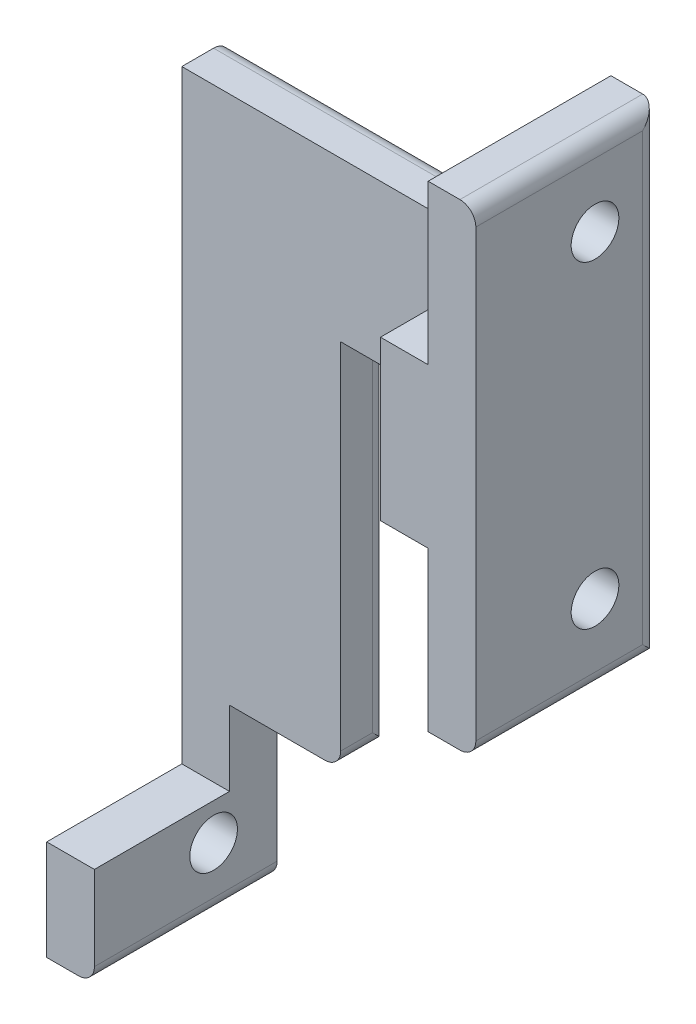
ISO-10303-21;
HEADER;
FILE_DESCRIPTION(('STEP AP214'),'2;1');
FILE_NAME('part.step','',(''),(''),'','','');
FILE_SCHEMA(('AUTOMOTIVE_DESIGN { 1 0 10303 214 1 1 1 1 }'));
ENDSEC;
DATA;
#1=APPLICATION_CONTEXT('core data for automotive mechanical design processes');
#2=APPLICATION_PROTOCOL_DEFINITION('international standard','automotive_design',2000,#1);
#3=PRODUCT_CONTEXT('',#1,'mechanical');
#4=PRODUCT('Part','Part','',(#3));
#5=PRODUCT_RELATED_PRODUCT_CATEGORY('part','',(#4));
#6=PRODUCT_DEFINITION_FORMATION('','',#4);
#7=PRODUCT_DEFINITION_CONTEXT('part definition',#1,'design');
#8=PRODUCT_DEFINITION('design','',#6,#7);
#9=PRODUCT_DEFINITION_SHAPE('','',#8);
#10=(LENGTH_UNIT() NAMED_UNIT(*) SI_UNIT(.MILLI.,.METRE.));
#11=(NAMED_UNIT(*) PLANE_ANGLE_UNIT() SI_UNIT($,.RADIAN.));
#12=(NAMED_UNIT(*) SI_UNIT($,.STERADIAN.) SOLID_ANGLE_UNIT());
#13=UNCERTAINTY_MEASURE_WITH_UNIT(LENGTH_MEASURE(1.E-05),#10,'distance_accuracy_value','');
#14=(GEOMETRIC_REPRESENTATION_CONTEXT(3) GLOBAL_UNCERTAINTY_ASSIGNED_CONTEXT((#13)) GLOBAL_UNIT_ASSIGNED_CONTEXT((#10,
#11,#12)) REPRESENTATION_CONTEXT('',''));
#15=CARTESIAN_POINT('',(0.,0.,0.));
#16=DIRECTION('',(0.,0.,1.));
#17=DIRECTION('',(1.,0.,0.));
#18=AXIS2_PLACEMENT_3D('',#15,#16,#17);
#19=CARTESIAN_POINT('',(0.,0.,0.));
#20=DIRECTION('',(-1.,0.,0.));
#21=DIRECTION('',(0.,0.,1.));
#22=AXIS2_PLACEMENT_3D('',#19,#20,#21);
#23=PLANE('',#22);
#24=CARTESIAN_POINT('',(0.,-40.3,4.));
#25=DIRECTION('',(-1.,0.,0.));
#26=DIRECTION('',(0.,0.,1.));
#27=AXIS2_PLACEMENT_3D('',#24,#25,#26);
#28=CIRCLE('',#27,1.5);
#29=CARTESIAN_POINT('',(0.,-40.3,5.5));
#30=VERTEX_POINT('',#29);
#31=EDGE_CURVE('E265',#30,#30,#28,.T.);
#32=ORIENTED_EDGE('',*,*,#31,.T.);
#33=EDGE_LOOP('',(#32));
#34=FACE_BOUND('',#33,.T.);
#35=DIRECTION('',(0.,0.,1.));
#36=VECTOR('',#35,1.);
#37=CARTESIAN_POINT('',(0.,-38.,0.));
#38=LINE('',#37,#36);
#39=CARTESIAN_POINT('',(0.,-38.,3.));
#40=VERTEX_POINT('',#39);
#41=CARTESIAN_POINT('',(0.,-38.,11.5));
#42=VERTEX_POINT('',#41);
#43=EDGE_CURVE('E643',#40,#42,#38,.T.);
#44=ORIENTED_EDGE('',*,*,#43,.T.);
#45=DIRECTION('',(0.,-1.,0.));
#46=VECTOR('',#45,1.);
#47=CARTESIAN_POINT('',(0.,0.,11.5));
#48=LINE('',#47,#46);
#49=CARTESIAN_POINT('',(0.,-43.3,11.5));
#50=VERTEX_POINT('',#49);
#51=EDGE_CURVE('E397',#42,#50,#48,.T.);
#52=ORIENTED_EDGE('',*,*,#51,.T.);
#53=DIRECTION('',(0.,0.,1.));
#54=VECTOR('',#53,1.);
#55=CARTESIAN_POINT('',(0.,-43.3,0.));
#56=LINE('',#55,#54);
#57=CARTESIAN_POINT('',(0.,-43.3,0.));
#58=VERTEX_POINT('',#57);
#59=EDGE_CURVE('E589',#50,#58,#56,.F.);
#60=ORIENTED_EDGE('',*,*,#59,.T.);
#61=DIRECTION('',(0.,-1.,0.));
#62=VECTOR('',#61,1.);
#63=CARTESIAN_POINT('',(0.,0.,0.));
#64=LINE('',#63,#62);
#65=CARTESIAN_POINT('',(0.,-33.3,0.));
#66=VERTEX_POINT('',#65);
#67=EDGE_CURVE('E262',#66,#58,#64,.T.);
#68=ORIENTED_EDGE('',*,*,#67,.F.);
#69=DIRECTION('',(0.,0.,-1.));
#70=VECTOR('',#69,1.);
#71=CARTESIAN_POINT('',(0.,-33.3,23.));
#72=LINE('',#71,#70);
#73=CARTESIAN_POINT('',(0.,-33.3,3.));
#74=VERTEX_POINT('',#73);
#75=EDGE_CURVE('E283',#74,#66,#72,.T.);
#76=ORIENTED_EDGE('',*,*,#75,.F.);
#77=DIRECTION('',(0.,-1.,0.));
#78=VECTOR('',#77,1.);
#79=CARTESIAN_POINT('',(0.,0.,3.));
#80=LINE('',#79,#78);
#81=EDGE_CURVE('E336',#74,#40,#80,.T.);
#82=ORIENTED_EDGE('',*,*,#81,.T.);
#83=EDGE_LOOP('',(#44,#52,#60,#68,#76,#82));
#84=FACE_BOUND('',#83,.T.);
#85=ADVANCED_FACE('F35',(#34,#84),#23,.F.);
#86=CARTESIAN_POINT('',(7.,-33.3,23.));
#87=DIRECTION('',(0.,1.,0.));
#88=DIRECTION('',(0.,0.,1.));
#89=AXIS2_PLACEMENT_3D('',#86,#87,#88);
#90=PLANE('',#89);
#91=DIRECTION('',(-1.,0.,0.));
#92=VECTOR('',#91,1.);
#93=CARTESIAN_POINT('',(7.,-33.3,0.));
#94=LINE('',#93,#92);
#95=CARTESIAN_POINT('',(6.,-33.3,0.));
#96=VERTEX_POINT('',#95);
#97=EDGE_CURVE('E289',#96,#66,#94,.T.);
#98=ORIENTED_EDGE('',*,*,#97,.F.);
#99=DIRECTION('',(0.,0.,-1.));
#100=VECTOR('',#99,1.);
#101=CARTESIAN_POINT('',(6.,-33.3,3.));
#102=LINE('',#101,#100);
#103=CARTESIAN_POINT('',(6.,-33.3,3.));
#104=VERTEX_POINT('',#103);
#105=EDGE_CURVE('E498',#96,#104,#102,.F.);
#106=ORIENTED_EDGE('',*,*,#105,.T.);
#107=DIRECTION('',(-1.,0.,0.));
#108=VECTOR('',#107,1.);
#109=CARTESIAN_POINT('',(7.,-33.3,3.));
#110=LINE('',#109,#108);
#111=EDGE_CURVE('E277',#104,#74,#110,.T.);
#112=ORIENTED_EDGE('',*,*,#111,.T.);
#113=ORIENTED_EDGE('',*,*,#75,.T.);
#114=EDGE_LOOP('',(#98,#106,#112,#113));
#115=FACE_BOUND('',#114,.T.);
#116=ADVANCED_FACE('F523',(#115),#90,.F.);
#117=CARTESIAN_POINT('',(7.,0.,23.));
#118=DIRECTION('',(0.,-1.,0.));
#119=DIRECTION('',(0.,0.,-1.));
#120=AXIS2_PLACEMENT_3D('',#117,#118,#119);
#121=PLANE('',#120);
#122=DIRECTION('',(0.,0.,1.));
#123=VECTOR('',#122,1.);
#124=CARTESIAN_POINT('',(18.,0.,23.));
#125=LINE('',#124,#123);
#126=CARTESIAN_POINT('',(18.,0.,3.));
#127=VERTEX_POINT('',#126);
#128=CARTESIAN_POINT('',(18.,0.,11.5));
#129=VERTEX_POINT('',#128);
#130=EDGE_CURVE('E335',#127,#129,#125,.T.);
#131=ORIENTED_EDGE('',*,*,#130,.T.);
#132=DIRECTION('',(1.,0.,0.));
#133=VECTOR('',#132,1.);
#134=CARTESIAN_POINT('',(7.,0.,11.5));
#135=LINE('',#134,#133);
#136=CARTESIAN_POINT('',(21.,0.,11.5));
#137=VERTEX_POINT('',#136);
#138=EDGE_CURVE('E603',#129,#137,#135,.T.);
#139=ORIENTED_EDGE('',*,*,#138,.T.);
#140=DIRECTION('',(0.,0.,1.));
#141=VECTOR('',#140,1.);
#142=CARTESIAN_POINT('',(21.,0.,23.));
#143=LINE('',#142,#141);
#144=CARTESIAN_POINT('',(21.,0.,1.));
#145=VERTEX_POINT('',#144);
#146=EDGE_CURVE('E323',#145,#137,#143,.T.);
#147=ORIENTED_EDGE('',*,*,#146,.F.);
#148=DIRECTION('',(-1.,0.,0.));
#149=VECTOR('',#148,1.);
#150=CARTESIAN_POINT('',(7.,0.,1.));
#151=LINE('',#150,#149);
#152=CARTESIAN_POINT('',(-3.,0.,1.));
#153=VERTEX_POINT('',#152);
#154=EDGE_CURVE('E322',#145,#153,#151,.T.);
#155=ORIENTED_EDGE('',*,*,#154,.T.);
#156=DIRECTION('',(0.,0.,1.));
#157=VECTOR('',#156,1.);
#158=CARTESIAN_POINT('',(-3.,0.,0.));
#159=LINE('',#158,#157);
#160=CARTESIAN_POINT('',(-3.,0.,3.));
#161=VERTEX_POINT('',#160);
#162=EDGE_CURVE('E242',#153,#161,#159,.T.);
#163=ORIENTED_EDGE('',*,*,#162,.T.);
#164=DIRECTION('',(-1.,0.,0.));
#165=VECTOR('',#164,1.);
#166=CARTESIAN_POINT('',(7.,0.,3.));
#167=LINE('',#166,#165);
#168=EDGE_CURVE('E276',#127,#161,#167,.T.);
#169=ORIENTED_EDGE('',*,*,#168,.F.);
#170=EDGE_LOOP('',(#131,#139,#147,#155,#163,#169));
#171=FACE_BOUND('',#170,.T.);
#172=ADVANCED_FACE('F530',(#171),#121,.F.);
#173=CARTESIAN_POINT('',(7.,0.,0.));
#174=DIRECTION('',(1.,0.,0.));
#175=DIRECTION('',(0.,0.,-1.));
#176=AXIS2_PLACEMENT_3D('',#173,#174,#175);
#177=PLANE('',#176);
#178=DIRECTION('',(0.,1.,0.));
#179=VECTOR('',#178,1.);
#180=CARTESIAN_POINT('',(7.,-33.3,3.));
#181=LINE('',#180,#179);
#182=CARTESIAN_POINT('',(7.,-32.3,3.));
#183=VERTEX_POINT('',#182);
#184=CARTESIAN_POINT('',(7.,-10.,3.));
#185=VERTEX_POINT('',#184);
#186=EDGE_CURVE('E279',#183,#185,#181,.T.);
#187=ORIENTED_EDGE('',*,*,#186,.F.);
#188=DIRECTION('',(0.,0.,-1.));
#189=VECTOR('',#188,1.);
#190=CARTESIAN_POINT('',(7.,-32.3,0.));
#191=LINE('',#190,#189);
#192=CARTESIAN_POINT('',(7.,-32.3,0.999999999999996));
#193=VERTEX_POINT('',#192);
#194=EDGE_CURVE('E495',#183,#193,#191,.T.);
#195=ORIENTED_EDGE('',*,*,#194,.T.);
#196=DIRECTION('',(0.,1.,0.));
#197=VECTOR('',#196,1.);
#198=CARTESIAN_POINT('',(7.,-10.,0.999999999999999));
#199=LINE('',#198,#197);
#200=CARTESIAN_POINT('',(7.,-10.,0.999999999999999));
#201=VERTEX_POINT('',#200);
#202=EDGE_CURVE('E479',#193,#201,#199,.T.);
#203=ORIENTED_EDGE('',*,*,#202,.T.);
#204=DIRECTION('',(0.,0.,-1.));
#205=VECTOR('',#204,1.);
#206=CARTESIAN_POINT('',(7.,-10.,0.));
#207=LINE('',#206,#205);
#208=EDGE_CURVE('E259',#185,#201,#207,.T.);
#209=ORIENTED_EDGE('',*,*,#208,.F.);
#210=EDGE_LOOP('',(#187,#195,#203,#209));
#211=FACE_BOUND('',#210,.T.);
#212=ADVANCED_FACE('F494',(#211),#177,.T.);
#213=CARTESIAN_POINT('',(7.,-33.3,3.));
#214=DIRECTION('',(0.,0.,-1.));
#215=DIRECTION('',(-1.,0.,0.));
#216=AXIS2_PLACEMENT_3D('',#213,#214,#215);
#217=PLANE('',#216);
#218=ORIENTED_EDGE('',*,*,#111,.F.);
#219=CARTESIAN_POINT('',(6.,-32.3,3.));
#220=DIRECTION('',(0.,0.,-1.));
#221=DIRECTION('',(-1.,0.,0.));
#222=AXIS2_PLACEMENT_3D('',#219,#220,#221);
#223=CIRCLE('',#222,1.);
#224=EDGE_CURVE('E295',#104,#183,#223,.F.);
#225=ORIENTED_EDGE('',*,*,#224,.T.);
#226=ORIENTED_EDGE('',*,*,#186,.T.);
#227=DIRECTION('',(-1.,0.,0.));
#228=VECTOR('',#227,1.);
#229=CARTESIAN_POINT('',(0.,-10.,3.));
#230=LINE('',#229,#228);
#231=CARTESIAN_POINT('',(18.,-10.,3.));
#232=VERTEX_POINT('',#231);
#233=EDGE_CURVE('E347',#232,#185,#230,.T.);
#234=ORIENTED_EDGE('',*,*,#233,.F.);
#235=DIRECTION('',(0.,-1.,0.));
#236=VECTOR('',#235,1.);
#237=CARTESIAN_POINT('',(18.,0.,3.));
#238=LINE('',#237,#236);
#239=EDGE_CURVE('E342',#127,#232,#238,.T.);
#240=ORIENTED_EDGE('',*,*,#239,.F.);
#241=ORIENTED_EDGE('',*,*,#168,.T.);
#242=DIRECTION('',(0.,1.,0.));
#243=VECTOR('',#242,1.);
#244=CARTESIAN_POINT('',(-3.,0.,3.));
#245=LINE('',#244,#243);
#246=CARTESIAN_POINT('',(-3.,-38.,3.));
#247=VERTEX_POINT('',#246);
#248=EDGE_CURVE('E648',#247,#161,#245,.T.);
#249=ORIENTED_EDGE('',*,*,#248,.F.);
#250=DIRECTION('',(1.,0.,0.));
#251=VECTOR('',#250,1.);
#252=CARTESIAN_POINT('',(-3.,-38.,3.));
#253=LINE('',#252,#251);
#254=EDGE_CURVE('E646',#247,#40,#253,.T.);
#255=ORIENTED_EDGE('',*,*,#254,.T.);
#256=ORIENTED_EDGE('',*,*,#81,.F.);
#257=EDGE_LOOP('',(#218,#225,#226,#234,#240,#241,#249,#255,#256));
#258=FACE_BOUND('',#257,.T.);
#259=CARTESIAN_POINT('',(15.,-5.,3.));
#260=DIRECTION('',(0.,0.,-1.));
#261=DIRECTION('',(0.,1.,0.));
#262=AXIS2_PLACEMENT_3D('',#259,#260,#261);
#263=CIRCLE('',#262,1.5);
#264=CARTESIAN_POINT('',(15.,-3.5,3.));
#265=VERTEX_POINT('',#264);
#266=EDGE_CURVE('E339',#265,#265,#263,.T.);
#267=ORIENTED_EDGE('',*,*,#266,.T.);
#268=EDGE_LOOP('',(#267));
#269=FACE_BOUND('',#268,.T.);
#270=ADVANCED_FACE('F507',(#258,#269),#217,.F.);
#271=CARTESIAN_POINT('',(0.,-10.,22.));
#272=DIRECTION('',(0.,-1.,0.));
#273=DIRECTION('',(0.,0.,-1.));
#274=AXIS2_PLACEMENT_3D('',#271,#272,#273);
#275=PLANE('',#274);
#276=DIRECTION('',(1.,0.,0.));
#277=VECTOR('',#276,1.);
#278=CARTESIAN_POINT('',(0.,-10.,11.5));
#279=LINE('',#278,#277);
#280=CARTESIAN_POINT('',(18.,-10.,11.5));
#281=VERTEX_POINT('',#280);
#282=CARTESIAN_POINT('',(21.,-10.,11.5));
#283=VERTEX_POINT('',#282);
#284=EDGE_CURVE('E598',#281,#283,#279,.T.);
#285=ORIENTED_EDGE('',*,*,#284,.F.);
#286=DIRECTION('',(0.,0.,-1.));
#287=VECTOR('',#286,1.);
#288=CARTESIAN_POINT('',(18.,-10.,23.));
#289=LINE('',#288,#287);
#290=EDGE_CURVE('E333',#281,#232,#289,.T.);
#291=ORIENTED_EDGE('',*,*,#290,.T.);
#292=ORIENTED_EDGE('',*,*,#233,.T.);
#293=ORIENTED_EDGE('',*,*,#208,.T.);
#294=DIRECTION('',(-1.,0.,0.));
#295=VECTOR('',#294,1.);
#296=CARTESIAN_POINT('',(21.,-10.,0.999999999999999));
#297=LINE('',#296,#295);
#298=CARTESIAN_POINT('',(21.,-10.,0.999999999999997));
#299=VERTEX_POINT('',#298);
#300=EDGE_CURVE('E319',#201,#299,#297,.F.);
#301=ORIENTED_EDGE('',*,*,#300,.T.);
#302=DIRECTION('',(0.,0.,-1.));
#303=VECTOR('',#302,1.);
#304=CARTESIAN_POINT('',(21.,-10.,23.));
#305=LINE('',#304,#303);
#306=EDGE_CURVE('E39',#283,#299,#305,.T.);
#307=ORIENTED_EDGE('',*,*,#306,.F.);
#308=EDGE_LOOP('',(#285,#291,#292,#293,#301,#307));
#309=FACE_BOUND('',#308,.T.);
#310=ADVANCED_FACE('F489',(#309),#275,.T.);
#311=CARTESIAN_POINT('',(-3.,-33.3,0.));
#312=DIRECTION('',(0.,-1.,0.));
#313=DIRECTION('',(0.,0.,-1.));
#314=AXIS2_PLACEMENT_3D('',#311,#312,#313);
#315=PLANE('',#314);
#316=DIRECTION('',(1.,0.,0.));
#317=VECTOR('',#316,1.);
#318=CARTESIAN_POINT('',(-3.,-33.3,-7.));
#319=LINE('',#318,#317);
#320=CARTESIAN_POINT('',(-3.,-33.3,-7.));
#321=VERTEX_POINT('',#320);
#322=CARTESIAN_POINT('',(-1.,-33.3,-7.));
#323=VERTEX_POINT('',#322);
#324=EDGE_CURVE('E254',#321,#323,#319,.T.);
#325=ORIENTED_EDGE('',*,*,#324,.T.);
#326=DIRECTION('',(0.,0.,-1.));
#327=VECTOR('',#326,1.);
#328=CARTESIAN_POINT('',(-1.,-33.3,0.));
#329=LINE('',#328,#327);
#330=CARTESIAN_POINT('',(-1.,-33.3,0.));
#331=VERTEX_POINT('',#330);
#332=EDGE_CURVE('E304',#323,#331,#329,.F.);
#333=ORIENTED_EDGE('',*,*,#332,.T.);
#334=DIRECTION('',(1.,0.,0.));
#335=VECTOR('',#334,1.);
#336=CARTESIAN_POINT('',(-3.,-33.3,0.));
#337=LINE('',#336,#335);
#338=CARTESIAN_POINT('',(-3.,-33.3,0.));
#339=VERTEX_POINT('',#338);
#340=EDGE_CURVE('E273',#339,#331,#337,.T.);
#341=ORIENTED_EDGE('',*,*,#340,.F.);
#342=DIRECTION('',(0.,0.,-1.));
#343=VECTOR('',#342,1.);
#344=CARTESIAN_POINT('',(-3.,-33.3,0.));
#345=LINE('',#344,#343);
#346=EDGE_CURVE('E246',#339,#321,#345,.T.);
#347=ORIENTED_EDGE('',*,*,#346,.T.);
#348=EDGE_LOOP('',(#325,#333,#341,#347));
#349=FACE_BOUND('',#348,.T.);
#350=ADVANCED_FACE('F358',(#349),#315,.T.);
#351=CARTESIAN_POINT('',(-3.,0.,0.));
#352=DIRECTION('',(0.,0.,1.));
#353=DIRECTION('',(0.,-1.,0.));
#354=AXIS2_PLACEMENT_3D('',#351,#352,#353);
#355=PLANE('',#354);
#356=ORIENTED_EDGE('',*,*,#67,.T.);
#357=CARTESIAN_POINT('',(-1.,-43.3,0.));
#358=DIRECTION('',(0.,0.,1.));
#359=DIRECTION('',(0.,-1.,0.));
#360=AXIS2_PLACEMENT_3D('',#357,#358,#359);
#361=CIRCLE('',#360,1.);
#362=CARTESIAN_POINT('',(-1.,-44.3,0.));
#363=VERTEX_POINT('',#362);
#364=EDGE_CURVE('E496',#58,#363,#361,.F.);
#365=ORIENTED_EDGE('',*,*,#364,.T.);
#366=DIRECTION('',(1.,0.,0.));
#367=VECTOR('',#366,1.);
#368=CARTESIAN_POINT('',(-3.,-44.3,0.));
#369=LINE('',#368,#367);
#370=CARTESIAN_POINT('',(-3.,-44.3,0.));
#371=VERTEX_POINT('',#370);
#372=EDGE_CURVE('E271',#371,#363,#369,.T.);
#373=ORIENTED_EDGE('',*,*,#372,.F.);
#374=DIRECTION('',(0.,-1.,0.));
#375=VECTOR('',#374,1.);
#376=CARTESIAN_POINT('',(-3.,0.,0.));
#377=LINE('',#376,#375);
#378=EDGE_CURVE('E240',#339,#371,#377,.T.);
#379=ORIENTED_EDGE('',*,*,#378,.F.);
#380=ORIENTED_EDGE('',*,*,#340,.T.);
#381=CARTESIAN_POINT('',(-1.,-32.3,0.));
#382=DIRECTION('',(0.,0.,1.));
#383=DIRECTION('',(0.,-1.,0.));
#384=AXIS2_PLACEMENT_3D('',#381,#382,#383);
#385=CIRCLE('',#384,1.);
#386=CARTESIAN_POINT('',(0.,-32.3,0.));
#387=VERTEX_POINT('',#386);
#388=EDGE_CURVE('E629',#331,#387,#385,.T.);
#389=ORIENTED_EDGE('',*,*,#388,.T.);
#390=DIRECTION('',(0.,1.,0.));
#391=VECTOR('',#390,1.);
#392=CARTESIAN_POINT('',(0.,0.,0.));
#393=LINE('',#392,#391);
#394=CARTESIAN_POINT('',(0.,-11.,0.));
#395=VERTEX_POINT('',#394);
#396=EDGE_CURVE('E286',#387,#395,#393,.T.);
#397=ORIENTED_EDGE('',*,*,#396,.T.);
#398=CARTESIAN_POINT('',(-1.,-11.,0.));
#399=DIRECTION('',(0.,0.,1.));
#400=DIRECTION('',(0.,-1.,0.));
#401=AXIS2_PLACEMENT_3D('',#398,#399,#400);
#402=CIRCLE('',#401,1.);
#403=CARTESIAN_POINT('',(-1.,-10.,0.));
#404=VERTEX_POINT('',#403);
#405=EDGE_CURVE('E466',#395,#404,#402,.T.);
#406=ORIENTED_EDGE('',*,*,#405,.T.);
#407=DIRECTION('',(1.,0.,0.));
#408=VECTOR('',#407,1.);
#409=CARTESIAN_POINT('',(-3.,-10.,0.));
#410=LINE('',#409,#408);
#411=CARTESIAN_POINT('',(-3.,-10.,0.));
#412=VERTEX_POINT('',#411);
#413=EDGE_CURVE('E632',#412,#404,#410,.T.);
#414=ORIENTED_EDGE('',*,*,#413,.F.);
#415=DIRECTION('',(0.,-1.,0.));
#416=VECTOR('',#415,1.);
#417=CARTESIAN_POINT('',(-3.,0.,0.));
#418=LINE('',#417,#416);
#419=CARTESIAN_POINT('',(-3.,-1.,0.));
#420=VERTEX_POINT('',#419);
#421=EDGE_CURVE('E431',#420,#412,#418,.T.);
#422=ORIENTED_EDGE('',*,*,#421,.F.);
#423=DIRECTION('',(-1.,0.,0.));
#424=VECTOR('',#423,1.);
#425=CARTESIAN_POINT('',(7.,-1.,0.));
#426=LINE('',#425,#424);
#427=CARTESIAN_POINT('',(21.,-1.,0.));
#428=VERTEX_POINT('',#427);
#429=EDGE_CURVE('E312',#420,#428,#426,.F.);
#430=ORIENTED_EDGE('',*,*,#429,.T.);
#431=DIRECTION('',(0.,-1.,0.));
#432=VECTOR('',#431,1.);
#433=CARTESIAN_POINT('',(21.,0.,0.));
#434=LINE('',#433,#432);
#435=CARTESIAN_POINT('',(21.,10.,0.));
#436=VERTEX_POINT('',#435);
#437=EDGE_CURVE('E426',#436,#428,#434,.T.);
#438=ORIENTED_EDGE('',*,*,#437,.F.);
#439=DIRECTION('',(-1.,0.,0.));
#440=VECTOR('',#439,1.);
#441=CARTESIAN_POINT('',(24.,10.,0.));
#442=LINE('',#441,#440);
#443=CARTESIAN_POINT('',(23.,10.,0.));
#444=VERTEX_POINT('',#443);
#445=EDGE_CURVE('E428',#444,#436,#442,.T.);
#446=ORIENTED_EDGE('',*,*,#445,.F.);
#447=DIRECTION('',(0.,-1.,0.));
#448=VECTOR('',#447,1.);
#449=CARTESIAN_POINT('',(23.,-20.,0.));
#450=LINE('',#449,#448);
#451=CARTESIAN_POINT('',(23.,-20.,0.));
#452=VERTEX_POINT('',#451);
#453=EDGE_CURVE('E310',#444,#452,#450,.T.);
#454=ORIENTED_EDGE('',*,*,#453,.T.);
#455=DIRECTION('',(-1.,0.,0.));
#456=VECTOR('',#455,1.);
#457=CARTESIAN_POINT('',(24.,-20.,0.));
#458=LINE('',#457,#456);
#459=CARTESIAN_POINT('',(21.,-20.,0.));
#460=VERTEX_POINT('',#459);
#461=EDGE_CURVE('E413',#452,#460,#458,.T.);
#462=ORIENTED_EDGE('',*,*,#461,.T.);
#463=CARTESIAN_POINT('',(21.,-9.,0.));
#464=VERTEX_POINT('',#463);
#465=EDGE_CURVE('E417',#464,#460,#434,.T.);
#466=ORIENTED_EDGE('',*,*,#465,.F.);
#467=DIRECTION('',(-1.,0.,0.));
#468=VECTOR('',#467,1.);
#469=CARTESIAN_POINT('',(7.,-9.,0.));
#470=LINE('',#469,#468);
#471=CARTESIAN_POINT('',(6.,-9.,0.));
#472=VERTEX_POINT('',#471);
#473=EDGE_CURVE('E315',#464,#472,#470,.T.);
#474=ORIENTED_EDGE('',*,*,#473,.T.);
#475=DIRECTION('',(0.,1.,0.));
#476=VECTOR('',#475,1.);
#477=CARTESIAN_POINT('',(6.,-33.3,0.));
#478=LINE('',#477,#476);
#479=EDGE_CURVE('E317',#472,#96,#478,.F.);
#480=ORIENTED_EDGE('',*,*,#479,.T.);
#481=ORIENTED_EDGE('',*,*,#97,.T.);
#482=EDGE_LOOP('',(#356,#365,#373,#379,#380,#389,#397,#406,#414,#422,#430,#438,#446,#454,#462,
#466,#474,#480,#481));
#483=FACE_BOUND('',#482,.T.);
#484=CARTESIAN_POINT('',(15.,-5.,0.));
#485=DIRECTION('',(0.,0.,-1.));
#486=DIRECTION('',(0.,1.,0.));
#487=AXIS2_PLACEMENT_3D('',#484,#485,#486);
#488=CIRCLE('',#487,1.5);
#489=CARTESIAN_POINT('',(15.,-3.5,0.));
#490=VERTEX_POINT('',#489);
#491=EDGE_CURVE('E327',#490,#490,#488,.T.);
#492=ORIENTED_EDGE('',*,*,#491,.F.);
#493=EDGE_LOOP('',(#492));
#494=FACE_BOUND('',#493,.T.);
#495=ADVANCED_FACE('F452',(#483,#494),#355,.F.);
#496=CARTESIAN_POINT('',(-3.,-44.3,0.));
#497=DIRECTION('',(0.,1.,0.));
#498=DIRECTION('',(0.,0.,1.));
#499=AXIS2_PLACEMENT_3D('',#496,#497,#498);
#500=PLANE('',#499);
#501=DIRECTION('',(0.,0.,1.));
#502=VECTOR('',#501,1.);
#503=CARTESIAN_POINT('',(-1.,-44.3,0.));
#504=LINE('',#503,#502);
#505=CARTESIAN_POINT('',(-1.,-44.3,11.5));
#506=VERTEX_POINT('',#505);
#507=EDGE_CURVE('E234',#363,#506,#504,.T.);
#508=ORIENTED_EDGE('',*,*,#507,.T.);
#509=DIRECTION('',(1.,0.,0.));
#510=VECTOR('',#509,1.);
#511=CARTESIAN_POINT('',(-3.,-44.3,11.5));
#512=LINE('',#511,#510);
#513=CARTESIAN_POINT('',(-3.,-44.3,11.5));
#514=VERTEX_POINT('',#513);
#515=EDGE_CURVE('E52',#514,#506,#512,.T.);
#516=ORIENTED_EDGE('',*,*,#515,.F.);
#517=DIRECTION('',(0.,0.,1.));
#518=VECTOR('',#517,1.);
#519=CARTESIAN_POINT('',(-3.,-44.3,0.));
#520=LINE('',#519,#518);
#521=EDGE_CURVE('E231',#371,#514,#520,.T.);
#522=ORIENTED_EDGE('',*,*,#521,.F.);
#523=ORIENTED_EDGE('',*,*,#372,.T.);
#524=EDGE_LOOP('',(#508,#516,#522,#523));
#525=FACE_BOUND('',#524,.T.);
#526=ADVANCED_FACE('F229',(#525),#500,.F.);
#527=CARTESIAN_POINT('',(-3.,0.,-7.));
#528=DIRECTION('',(0.,0.,1.));
#529=DIRECTION('',(0.,-1.,0.));
#530=AXIS2_PLACEMENT_3D('',#527,#528,#529);
#531=PLANE('',#530);
#532=DIRECTION('',(1.,0.,0.));
#533=VECTOR('',#532,1.);
#534=CARTESIAN_POINT('',(-3.,-10.,-7.));
#535=LINE('',#534,#533);
#536=CARTESIAN_POINT('',(-3.,-10.,-7.));
#537=VERTEX_POINT('',#536);
#538=CARTESIAN_POINT('',(-1.,-10.,-7.));
#539=VERTEX_POINT('',#538);
#540=EDGE_CURVE('E369',#537,#539,#535,.T.);
#541=ORIENTED_EDGE('',*,*,#540,.T.);
#542=DIRECTION('',(0.,-1.,0.));
#543=VECTOR('',#542,1.);
#544=CARTESIAN_POINT('',(-1.,0.,-7.));
#545=LINE('',#544,#543);
#546=EDGE_CURVE('E308',#539,#323,#545,.T.);
#547=ORIENTED_EDGE('',*,*,#546,.T.);
#548=ORIENTED_EDGE('',*,*,#324,.F.);
#549=DIRECTION('',(0.,-1.,0.));
#550=VECTOR('',#549,1.);
#551=CARTESIAN_POINT('',(-3.,0.,-7.));
#552=LINE('',#551,#550);
#553=EDGE_CURVE('E244',#537,#321,#552,.T.);
#554=ORIENTED_EDGE('',*,*,#553,.F.);
#555=EDGE_LOOP('',(#541,#547,#548,#554));
#556=FACE_BOUND('',#555,.T.);
#557=ADVANCED_FACE('F367',(#556),#531,.F.);
#558=CARTESIAN_POINT('',(-3.,-15.,-4.));
#559=DIRECTION('',(1.,0.,0.));
#560=DIRECTION('',(0.,0.,-1.));
#561=AXIS2_PLACEMENT_3D('',#558,#559,#560);
#562=CYLINDRICAL_SURFACE('',#561,1.5);
#563=CARTESIAN_POINT('',(-3.,-15.,-4.));
#564=DIRECTION('',(-1.,0.,0.));
#565=DIRECTION('',(0.,0.,1.));
#566=AXIS2_PLACEMENT_3D('',#563,#564,#565);
#567=CIRCLE('',#566,1.5);
#568=CARTESIAN_POINT('',(-3.,-15.,-2.5));
#569=VERTEX_POINT('',#568);
#570=EDGE_CURVE('E354',#569,#569,#567,.T.);
#571=ORIENTED_EDGE('',*,*,#570,.T.);
#572=EDGE_LOOP('',(#571));
#573=FACE_BOUND('',#572,.T.);
#574=CARTESIAN_POINT('',(0.,-15.,-4.));
#575=DIRECTION('',(-1.,0.,0.));
#576=DIRECTION('',(0.,0.,1.));
#577=AXIS2_PLACEMENT_3D('',#574,#575,#576);
#578=CIRCLE('',#577,1.5);
#579=CARTESIAN_POINT('',(0.,-15.,-2.5));
#580=VERTEX_POINT('',#579);
#581=EDGE_CURVE('E258',#580,#580,#578,.T.);
#582=ORIENTED_EDGE('',*,*,#581,.F.);
#583=EDGE_LOOP('',(#582));
#584=FACE_BOUND('',#583,.T.);
#585=ADVANCED_FACE('F552',(#573,#584),#562,.F.);
#586=CARTESIAN_POINT('',(-3.,-28.3,-4.));
#587=DIRECTION('',(1.,0.,0.));
#588=DIRECTION('',(0.,0.,-1.));
#589=AXIS2_PLACEMENT_3D('',#586,#587,#588);
#590=CYLINDRICAL_SURFACE('',#589,1.5);
#591=CARTESIAN_POINT('',(-3.,-28.3,-4.));
#592=DIRECTION('',(-1.,0.,0.));
#593=DIRECTION('',(0.,0.,1.));
#594=AXIS2_PLACEMENT_3D('',#591,#592,#593);
#595=CIRCLE('',#594,1.5);
#596=CARTESIAN_POINT('',(-3.,-28.3,-2.5));
#597=VERTEX_POINT('',#596);
#598=EDGE_CURVE('E268',#597,#597,#595,.T.);
#599=ORIENTED_EDGE('',*,*,#598,.T.);
#600=EDGE_LOOP('',(#599));
#601=FACE_BOUND('',#600,.T.);
#602=CARTESIAN_POINT('',(0.,-28.3,-4.));
#603=DIRECTION('',(-1.,0.,0.));
#604=DIRECTION('',(0.,0.,1.));
#605=AXIS2_PLACEMENT_3D('',#602,#603,#604);
#606=CIRCLE('',#605,1.5);
#607=CARTESIAN_POINT('',(0.,-28.3,-2.5));
#608=VERTEX_POINT('',#607);
#609=EDGE_CURVE('E255',#608,#608,#606,.T.);
#610=ORIENTED_EDGE('',*,*,#609,.F.);
#611=EDGE_LOOP('',(#610));
#612=FACE_BOUND('',#611,.T.);
#613=ADVANCED_FACE('F554',(#601,#612),#590,.F.);
#614=CARTESIAN_POINT('',(-3.,-40.3,4.));
#615=DIRECTION('',(1.,0.,0.));
#616=DIRECTION('',(0.,0.,-1.));
#617=AXIS2_PLACEMENT_3D('',#614,#615,#616);
#618=CYLINDRICAL_SURFACE('',#617,1.5);
#619=CARTESIAN_POINT('',(-3.,-40.3,4.));
#620=DIRECTION('',(-1.,0.,0.));
#621=DIRECTION('',(0.,0.,1.));
#622=AXIS2_PLACEMENT_3D('',#619,#620,#621);
#623=CIRCLE('',#622,1.5);
#624=CARTESIAN_POINT('',(-3.,-40.3,5.5));
#625=VERTEX_POINT('',#624);
#626=EDGE_CURVE('E251',#625,#625,#623,.T.);
#627=ORIENTED_EDGE('',*,*,#626,.T.);
#628=EDGE_LOOP('',(#627));
#629=FACE_BOUND('',#628,.T.);
#630=ORIENTED_EDGE('',*,*,#31,.F.);
#631=EDGE_LOOP('',(#630));
#632=FACE_BOUND('',#631,.T.);
#633=ADVANCED_FACE('F545',(#629,#632),#618,.F.);
#634=CARTESIAN_POINT('',(-3.,0.,0.));
#635=DIRECTION('',(-1.,0.,0.));
#636=DIRECTION('',(0.,0.,1.));
#637=AXIS2_PLACEMENT_3D('',#634,#635,#636);
#638=PLANE('',#637);
#639=DIRECTION('',(0.,-1.,0.));
#640=VECTOR('',#639,1.);
#641=CARTESIAN_POINT('',(-3.,10.000025,11.5));
#642=LINE('',#641,#640);
#643=CARTESIAN_POINT('',(-3.,-38.,11.5));
#644=VERTEX_POINT('',#643);
#645=EDGE_CURVE('E219',#644,#514,#642,.T.);
#646=ORIENTED_EDGE('',*,*,#645,.F.);
#647=DIRECTION('',(0.,0.,-1.));
#648=VECTOR('',#647,1.);
#649=CARTESIAN_POINT('',(-3.,-38.,22.));
#650=LINE('',#649,#648);
#651=EDGE_CURVE('E653',#644,#247,#650,.T.);
#652=ORIENTED_EDGE('',*,*,#651,.T.);
#653=ORIENTED_EDGE('',*,*,#248,.T.);
#654=ORIENTED_EDGE('',*,*,#162,.F.);
#655=CARTESIAN_POINT('',(-3.,-1.,1.));
#656=DIRECTION('',(-1.,0.,0.));
#657=DIRECTION('',(0.,0.,1.));
#658=AXIS2_PLACEMENT_3D('',#655,#656,#657);
#659=CIRCLE('',#658,1.);
#660=EDGE_CURVE('E623',#153,#420,#659,.T.);
#661=ORIENTED_EDGE('',*,*,#660,.T.);
#662=ORIENTED_EDGE('',*,*,#421,.T.);
#663=DIRECTION('',(0.,0.,-1.));
#664=VECTOR('',#663,1.);
#665=CARTESIAN_POINT('',(-3.,-10.,-7.));
#666=LINE('',#665,#664);
#667=EDGE_CURVE('E364',#412,#537,#666,.T.);
#668=ORIENTED_EDGE('',*,*,#667,.T.);
#669=ORIENTED_EDGE('',*,*,#553,.T.);
#670=ORIENTED_EDGE('',*,*,#346,.F.);
#671=ORIENTED_EDGE('',*,*,#378,.T.);
#672=ORIENTED_EDGE('',*,*,#521,.T.);
#673=EDGE_LOOP('',(#646,#652,#653,#654,#661,#662,#668,#669,#670,#671,#672));
#674=FACE_BOUND('',#673,.T.);
#675=ORIENTED_EDGE('',*,*,#598,.F.);
#676=EDGE_LOOP('',(#675));
#677=FACE_BOUND('',#676,.T.);
#678=ORIENTED_EDGE('',*,*,#570,.F.);
#679=EDGE_LOOP('',(#678));
#680=FACE_BOUND('',#679,.T.);
#681=ORIENTED_EDGE('',*,*,#626,.F.);
#682=EDGE_LOOP('',(#681));
#683=FACE_BOUND('',#682,.T.);
#684=ADVANCED_FACE('F236',(#674,#677,#680,#683),#638,.T.);
#685=ORIENTED_EDGE('',*,*,#396,.F.);
#686=DIRECTION('',(0.,0.,-1.));
#687=VECTOR('',#686,1.);
#688=CARTESIAN_POINT('',(0.,-32.3,-7.));
#689=LINE('',#688,#687);
#690=CARTESIAN_POINT('',(0.,-32.3,-6.));
#691=VERTEX_POINT('',#690);
#692=EDGE_CURVE('E301',#387,#691,#689,.T.);
#693=ORIENTED_EDGE('',*,*,#692,.T.);
#694=DIRECTION('',(0.,-1.,0.));
#695=VECTOR('',#694,1.);
#696=CARTESIAN_POINT('',(0.,0.,-6.));
#697=LINE('',#696,#695);
#698=CARTESIAN_POINT('',(0.,-11.,-6.));
#699=VERTEX_POINT('',#698);
#700=EDGE_CURVE('E297',#691,#699,#697,.F.);
#701=ORIENTED_EDGE('',*,*,#700,.T.);
#702=DIRECTION('',(0.,0.,-1.));
#703=VECTOR('',#702,1.);
#704=CARTESIAN_POINT('',(0.,-11.,0.));
#705=LINE('',#704,#703);
#706=EDGE_CURVE('E299',#699,#395,#705,.F.);
#707=ORIENTED_EDGE('',*,*,#706,.T.);
#708=EDGE_LOOP('',(#685,#693,#701,#707));
#709=FACE_BOUND('',#708,.T.);
#710=ORIENTED_EDGE('',*,*,#609,.T.);
#711=EDGE_LOOP('',(#710));
#712=FACE_BOUND('',#711,.T.);
#713=ORIENTED_EDGE('',*,*,#581,.T.);
#714=EDGE_LOOP('',(#713));
#715=FACE_BOUND('',#714,.T.);
#716=ADVANCED_FACE('F526',(#709,#712,#715),#23,.F.);
#717=CARTESIAN_POINT('',(15.,-5.,3.));
#718=DIRECTION('',(0.,0.,-1.));
#719=DIRECTION('',(0.,1.,0.));
#720=AXIS2_PLACEMENT_3D('',#717,#718,#719);
#721=CYLINDRICAL_SURFACE('',#720,1.5);
#722=ORIENTED_EDGE('',*,*,#266,.F.);
#723=EDGE_LOOP('',(#722));
#724=FACE_BOUND('',#723,.T.);
#725=ORIENTED_EDGE('',*,*,#491,.T.);
#726=EDGE_LOOP('',(#725));
#727=FACE_BOUND('',#726,.T.);
#728=ADVANCED_FACE('F536',(#724,#727),#721,.F.);
#729=CARTESIAN_POINT('',(18.,0.,0.));
#730=DIRECTION('',(1.,0.,0.));
#731=DIRECTION('',(0.,0.,-1.));
#732=AXIS2_PLACEMENT_3D('',#729,#730,#731);
#733=PLANE('',#732);
#734=ORIENTED_EDGE('',*,*,#290,.F.);
#735=DIRECTION('',(0.,1.,0.));
#736=VECTOR('',#735,1.);
#737=CARTESIAN_POINT('',(18.,0.,11.5));
#738=LINE('',#737,#736);
#739=EDGE_CURVE('E600',#281,#129,#738,.T.);
#740=ORIENTED_EDGE('',*,*,#739,.T.);
#741=ORIENTED_EDGE('',*,*,#130,.F.);
#742=ORIENTED_EDGE('',*,*,#239,.T.);
#743=EDGE_LOOP('',(#734,#740,#741,#742));
#744=FACE_BOUND('',#743,.T.);
#745=ADVANCED_FACE('F542',(#744),#733,.F.);
#746=CARTESIAN_POINT('',(-3.,-38.,22.));
#747=DIRECTION('',(0.,-1.,0.));
#748=DIRECTION('',(0.,0.,-1.));
#749=AXIS2_PLACEMENT_3D('',#746,#747,#748);
#750=PLANE('',#749);
#751=ORIENTED_EDGE('',*,*,#651,.F.);
#752=DIRECTION('',(1.,0.,0.));
#753=VECTOR('',#752,1.);
#754=CARTESIAN_POINT('',(-3.,-38.,11.5));
#755=LINE('',#754,#753);
#756=EDGE_CURVE('E222',#644,#42,#755,.T.);
#757=ORIENTED_EDGE('',*,*,#756,.T.);
#758=ORIENTED_EDGE('',*,*,#43,.F.);
#759=ORIENTED_EDGE('',*,*,#254,.F.);
#760=EDGE_LOOP('',(#751,#757,#758,#759));
#761=FACE_BOUND('',#760,.T.);
#762=ADVANCED_FACE('F750',(#761),#750,.F.);
#763=CARTESIAN_POINT('',(-3.,-10.,-7.));
#764=DIRECTION('',(0.,-1.,0.));
#765=DIRECTION('',(0.,0.,-1.));
#766=AXIS2_PLACEMENT_3D('',#763,#764,#765);
#767=PLANE('',#766);
#768=ORIENTED_EDGE('',*,*,#413,.T.);
#769=DIRECTION('',(0.,0.,-1.));
#770=VECTOR('',#769,1.);
#771=CARTESIAN_POINT('',(-1.,-10.,-7.));
#772=LINE('',#771,#770);
#773=EDGE_CURVE('E306',#404,#539,#772,.T.);
#774=ORIENTED_EDGE('',*,*,#773,.T.);
#775=ORIENTED_EDGE('',*,*,#540,.F.);
#776=ORIENTED_EDGE('',*,*,#667,.F.);
#777=EDGE_LOOP('',(#768,#774,#775,#776));
#778=FACE_BOUND('',#777,.T.);
#779=ADVANCED_FACE('F636',(#778),#767,.F.);
#780=CARTESIAN_POINT('',(21.,0.,0.));
#781=DIRECTION('',(1.,0.,0.));
#782=DIRECTION('',(0.,0.,-1.));
#783=AXIS2_PLACEMENT_3D('',#780,#781,#782);
#784=PLANE('',#783);
#785=CARTESIAN_POINT('',(21.,-15.,3.99999999999999));
#786=DIRECTION('',(1.,0.,0.));
#787=DIRECTION('',(0.,0.,-1.));
#788=AXIS2_PLACEMENT_3D('',#785,#786,#787);
#789=CIRCLE('',#788,1.5);
#790=CARTESIAN_POINT('',(21.,-15.,2.49999999999999));
#791=VERTEX_POINT('',#790);
#792=EDGE_CURVE('E414',#791,#791,#789,.T.);
#793=ORIENTED_EDGE('',*,*,#792,.T.);
#794=EDGE_LOOP('',(#793));
#795=FACE_BOUND('',#794,.T.);
#796=DIRECTION('',(0.,0.,-1.));
#797=VECTOR('',#796,1.);
#798=CARTESIAN_POINT('',(21.,-20.,0.));
#799=LINE('',#798,#797);
#800=CARTESIAN_POINT('',(21.,-20.,11.5));
#801=VERTEX_POINT('',#800);
#802=EDGE_CURVE('E435',#801,#460,#799,.T.);
#803=ORIENTED_EDGE('',*,*,#802,.F.);
#804=DIRECTION('',(0.,1.,0.));
#805=VECTOR('',#804,1.);
#806=CARTESIAN_POINT('',(21.,0.,11.5));
#807=LINE('',#806,#805);
#808=EDGE_CURVE('E595',#801,#283,#807,.T.);
#809=ORIENTED_EDGE('',*,*,#808,.T.);
#810=ORIENTED_EDGE('',*,*,#306,.T.);
#811=CARTESIAN_POINT('',(21.,-9.,0.999999999999999));
#812=DIRECTION('',(1.,0.,0.));
#813=DIRECTION('',(0.,0.,-1.));
#814=AXIS2_PLACEMENT_3D('',#811,#812,#813);
#815=CIRCLE('',#814,1.);
#816=EDGE_CURVE('E463',#299,#464,#815,.T.);
#817=ORIENTED_EDGE('',*,*,#816,.T.);
#818=ORIENTED_EDGE('',*,*,#465,.T.);
#819=EDGE_LOOP('',(#803,#809,#810,#817,#818));
#820=FACE_BOUND('',#819,.T.);
#821=ADVANCED_FACE('F663',(#795,#820),#784,.F.);
#822=CARTESIAN_POINT('',(21.,5.,4.));
#823=DIRECTION('',(1.,0.,0.));
#824=DIRECTION('',(0.,0.,-1.));
#825=AXIS2_PLACEMENT_3D('',#822,#823,#824);
#826=CIRCLE('',#825,1.5);
#827=CARTESIAN_POINT('',(21.,5.,2.5));
#828=VERTEX_POINT('',#827);
#829=EDGE_CURVE('E410',#828,#828,#826,.T.);
#830=ORIENTED_EDGE('',*,*,#829,.T.);
#831=EDGE_LOOP('',(#830));
#832=FACE_BOUND('',#831,.T.);
#833=ORIENTED_EDGE('',*,*,#146,.T.);
#834=DIRECTION('',(0.,1.,0.));
#835=VECTOR('',#834,1.);
#836=CARTESIAN_POINT('',(21.,0.,11.5));
#837=LINE('',#836,#835);
#838=CARTESIAN_POINT('',(21.,10.,11.5));
#839=VERTEX_POINT('',#838);
#840=EDGE_CURVE('E445',#137,#839,#837,.T.);
#841=ORIENTED_EDGE('',*,*,#840,.T.);
#842=DIRECTION('',(0.,0.,-1.));
#843=VECTOR('',#842,1.);
#844=CARTESIAN_POINT('',(21.,10.,0.));
#845=LINE('',#844,#843);
#846=EDGE_CURVE('E420',#839,#436,#845,.T.);
#847=ORIENTED_EDGE('',*,*,#846,.T.);
#848=ORIENTED_EDGE('',*,*,#437,.T.);
#849=CARTESIAN_POINT('',(21.,-1.,1.));
#850=DIRECTION('',(1.,0.,0.));
#851=DIRECTION('',(0.,0.,-1.));
#852=AXIS2_PLACEMENT_3D('',#849,#850,#851);
#853=CIRCLE('',#852,1.);
#854=EDGE_CURVE('E45',#428,#145,#853,.T.);
#855=ORIENTED_EDGE('',*,*,#854,.T.);
#856=EDGE_LOOP('',(#833,#841,#847,#848,#855));
#857=FACE_BOUND('',#856,.T.);
#858=ADVANCED_FACE('F443',(#832,#857),#784,.F.);
#859=CARTESIAN_POINT('',(24.,10.,0.));
#860=DIRECTION('',(0.,1.,0.));
#861=DIRECTION('',(0.,0.,1.));
#862=AXIS2_PLACEMENT_3D('',#859,#860,#861);
#863=PLANE('',#862);
#864=DIRECTION('',(-1.,0.,0.));
#865=VECTOR('',#864,1.);
#866=CARTESIAN_POINT('',(24.,10.,11.5));
#867=LINE('',#866,#865);
#868=CARTESIAN_POINT('',(23.,10.,11.5));
#869=VERTEX_POINT('',#868);
#870=EDGE_CURVE('E607',#869,#839,#867,.T.);
#871=ORIENTED_EDGE('',*,*,#870,.F.);
#872=DIRECTION('',(0.,0.,-1.));
#873=VECTOR('',#872,1.);
#874=CARTESIAN_POINT('',(23.,10.,0.));
#875=LINE('',#874,#873);
#876=EDGE_CURVE('E450',#869,#444,#875,.T.);
#877=ORIENTED_EDGE('',*,*,#876,.T.);
#878=ORIENTED_EDGE('',*,*,#445,.T.);
#879=ORIENTED_EDGE('',*,*,#846,.F.);
#880=EDGE_LOOP('',(#871,#877,#878,#879));
#881=FACE_BOUND('',#880,.T.);
#882=ADVANCED_FACE('F449',(#881),#863,.T.);
#883=CARTESIAN_POINT('',(24.,5.,4.));
#884=DIRECTION('',(-1.,0.,0.));
#885=DIRECTION('',(0.,0.,1.));
#886=AXIS2_PLACEMENT_3D('',#883,#884,#885);
#887=CYLINDRICAL_SURFACE('',#886,1.5);
#888=CARTESIAN_POINT('',(24.,5.,4.));
#889=DIRECTION('',(1.,0.,0.));
#890=DIRECTION('',(0.,0.,-1.));
#891=AXIS2_PLACEMENT_3D('',#888,#889,#890);
#892=CIRCLE('',#891,1.5);
#893=CARTESIAN_POINT('',(24.,5.,2.5));
#894=VERTEX_POINT('',#893);
#895=EDGE_CURVE('E409',#894,#894,#892,.T.);
#896=ORIENTED_EDGE('',*,*,#895,.T.);
#897=EDGE_LOOP('',(#896));
#898=FACE_BOUND('',#897,.T.);
#899=ORIENTED_EDGE('',*,*,#829,.F.);
#900=EDGE_LOOP('',(#899));
#901=FACE_BOUND('',#900,.T.);
#902=ADVANCED_FACE('F790',(#898,#901),#887,.F.);
#903=CARTESIAN_POINT('',(24.,-20.,0.));
#904=DIRECTION('',(0.,1.,0.));
#905=DIRECTION('',(0.,0.,1.));
#906=AXIS2_PLACEMENT_3D('',#903,#904,#905);
#907=PLANE('',#906);
#908=DIRECTION('',(0.,0.,-1.));
#909=VECTOR('',#908,1.);
#910=CARTESIAN_POINT('',(23.,-20.,23.));
#911=LINE('',#910,#909);
#912=CARTESIAN_POINT('',(23.,-20.,11.5));
#913=VERTEX_POINT('',#912);
#914=EDGE_CURVE('E627',#452,#913,#911,.F.);
#915=ORIENTED_EDGE('',*,*,#914,.T.);
#916=DIRECTION('',(-1.,0.,0.));
#917=VECTOR('',#916,1.);
#918=CARTESIAN_POINT('',(24.,-20.,11.5));
#919=LINE('',#918,#917);
#920=EDGE_CURVE('E591',#913,#801,#919,.T.);
#921=ORIENTED_EDGE('',*,*,#920,.T.);
#922=ORIENTED_EDGE('',*,*,#802,.T.);
#923=ORIENTED_EDGE('',*,*,#461,.F.);
#924=EDGE_LOOP('',(#915,#921,#922,#923));
#925=FACE_BOUND('',#924,.T.);
#926=ADVANCED_FACE('F665',(#925),#907,.F.);
#927=CARTESIAN_POINT('',(24.,-15.,3.99999999999999));
#928=DIRECTION('',(-1.,0.,0.));
#929=DIRECTION('',(0.,0.,1.));
#930=AXIS2_PLACEMENT_3D('',#927,#928,#929);
#931=CYLINDRICAL_SURFACE('',#930,1.5);
#932=CARTESIAN_POINT('',(24.,-15.,3.99999999999999));
#933=DIRECTION('',(1.,0.,0.));
#934=DIRECTION('',(0.,0.,-1.));
#935=AXIS2_PLACEMENT_3D('',#932,#933,#934);
#936=CIRCLE('',#935,1.5);
#937=CARTESIAN_POINT('',(24.,-15.,2.49999999999999));
#938=VERTEX_POINT('',#937);
#939=EDGE_CURVE('E406',#938,#938,#936,.T.);
#940=ORIENTED_EDGE('',*,*,#939,.T.);
#941=EDGE_LOOP('',(#940));
#942=FACE_BOUND('',#941,.T.);
#943=ORIENTED_EDGE('',*,*,#792,.F.);
#944=EDGE_LOOP('',(#943));
#945=FACE_BOUND('',#944,.T.);
#946=ADVANCED_FACE('F584',(#942,#945),#931,.F.);
#947=CARTESIAN_POINT('',(24.,0.,0.));
#948=DIRECTION('',(1.,0.,0.));
#949=DIRECTION('',(0.,0.,-1.));
#950=AXIS2_PLACEMENT_3D('',#947,#948,#949);
#951=PLANE('',#950);
#952=DIRECTION('',(0.,-1.,0.));
#953=VECTOR('',#952,1.);
#954=CARTESIAN_POINT('',(24.,10.000025,11.5));
#955=LINE('',#954,#953);
#956=CARTESIAN_POINT('',(24.,9.,11.5));
#957=VERTEX_POINT('',#956);
#958=CARTESIAN_POINT('',(24.,-19.,11.5));
#959=VERTEX_POINT('',#958);
#960=EDGE_CURVE('E59',#957,#959,#955,.T.);
#961=ORIENTED_EDGE('',*,*,#960,.T.);
#962=DIRECTION('',(0.,0.,-1.));
#963=VECTOR('',#962,1.);
#964=CARTESIAN_POINT('',(24.,-19.,0.));
#965=LINE('',#964,#963);
#966=CARTESIAN_POINT('',(24.,-19.,0.999999999999998));
#967=VERTEX_POINT('',#966);
#968=EDGE_CURVE('E612',#959,#967,#965,.T.);
#969=ORIENTED_EDGE('',*,*,#968,.T.);
#970=DIRECTION('',(0.,-1.,0.));
#971=VECTOR('',#970,1.);
#972=CARTESIAN_POINT('',(24.,10.,1.));
#973=LINE('',#972,#971);
#974=CARTESIAN_POINT('',(24.,9.,1.));
#975=VERTEX_POINT('',#974);
#976=EDGE_CURVE('E620',#967,#975,#973,.F.);
#977=ORIENTED_EDGE('',*,*,#976,.T.);
#978=DIRECTION('',(0.,0.,-1.));
#979=VECTOR('',#978,1.);
#980=CARTESIAN_POINT('',(24.,9.,0.));
#981=LINE('',#980,#979);
#982=EDGE_CURVE('E614',#975,#957,#981,.F.);
#983=ORIENTED_EDGE('',*,*,#982,.T.);
#984=EDGE_LOOP('',(#961,#969,#977,#983));
#985=FACE_BOUND('',#984,.T.);
#986=ORIENTED_EDGE('',*,*,#939,.F.);
#987=EDGE_LOOP('',(#986));
#988=FACE_BOUND('',#987,.T.);
#989=ORIENTED_EDGE('',*,*,#895,.F.);
#990=EDGE_LOOP('',(#989));
#991=FACE_BOUND('',#990,.T.);
#992=ADVANCED_FACE('F577',(#985,#988,#991),#951,.T.);
#993=CARTESIAN_POINT('',(-1.,-43.3,0.));
#994=DIRECTION('',(0.,0.,1.));
#995=DIRECTION('',(1.,0.,0.));
#996=AXIS2_PLACEMENT_3D('',#993,#994,#995);
#997=CYLINDRICAL_SURFACE('',#996,1.);
#998=CARTESIAN_POINT('',(-1.,-43.3,11.5));
#999=DIRECTION('',(0.,0.,-1.));
#1000=DIRECTION('',(-1.,0.,0.));
#1001=AXIS2_PLACEMENT_3D('',#998,#999,#1000);
#1002=CIRCLE('',#1001,1.);
#1003=EDGE_CURVE('E402',#506,#50,#1002,.F.);
#1004=ORIENTED_EDGE('',*,*,#1003,.F.);
#1005=ORIENTED_EDGE('',*,*,#507,.F.);
#1006=ORIENTED_EDGE('',*,*,#364,.F.);
#1007=ORIENTED_EDGE('',*,*,#59,.F.);
#1008=EDGE_LOOP('',(#1004,#1005,#1006,#1007));
#1009=FACE_BOUND('',#1008,.T.);
#1010=ADVANCED_FACE('F575',(#1009),#997,.T.);
#1011=CARTESIAN_POINT('',(7.,-9.,0.999999999999999));
#1012=DIRECTION('',(1.,0.,0.));
#1013=DIRECTION('',(0.,0.,-1.));
#1014=AXIS2_PLACEMENT_3D('',#1011,#1012,#1013);
#1015=CYLINDRICAL_SURFACE('',#1014,1.);
#1016=ORIENTED_EDGE('',*,*,#816,.F.);
#1017=ORIENTED_EDGE('',*,*,#300,.F.);
#1018=CARTESIAN_POINT('',(6.,-9.,0.999999999999999));
#1019=DIRECTION('',(-0.707106781186547,-0.707106781186547,0.));
#1020=DIRECTION('',(0.707106781186547,-0.707106781186547,0.));
#1021=AXIS2_PLACEMENT_3D('',#1018,#1019,#1020);
#1022=ELLIPSE('',#1021,1.41421356237309,1.);
#1023=EDGE_CURVE('E388',#472,#201,#1022,.T.);
#1024=ORIENTED_EDGE('',*,*,#1023,.F.);
#1025=ORIENTED_EDGE('',*,*,#473,.F.);
#1026=EDGE_LOOP('',(#1016,#1017,#1024,#1025));
#1027=FACE_BOUND('',#1026,.T.);
#1028=ADVANCED_FACE('F485',(#1027),#1015,.T.);
#1029=CARTESIAN_POINT('',(6.,0.,1.));
#1030=DIRECTION('',(0.,-1.,0.));
#1031=DIRECTION('',(0.,0.,-1.));
#1032=AXIS2_PLACEMENT_3D('',#1029,#1030,#1031);
#1033=CYLINDRICAL_SURFACE('',#1032,1.);
#1034=ORIENTED_EDGE('',*,*,#1023,.T.);
#1035=ORIENTED_EDGE('',*,*,#202,.F.);
#1036=CARTESIAN_POINT('',(6.,-32.3,0.999999999999996));
#1037=DIRECTION('',(0.,-0.707106781186548,0.707106781186547));
#1038=DIRECTION('',(0.,-0.707106781186547,-0.707106781186548));
#1039=AXIS2_PLACEMENT_3D('',#1036,#1037,#1038);
#1040=ELLIPSE('',#1039,1.4142135623731,1.);
#1041=EDGE_CURVE('E382',#96,#193,#1040,.T.);
#1042=ORIENTED_EDGE('',*,*,#1041,.F.);
#1043=ORIENTED_EDGE('',*,*,#479,.F.);
#1044=EDGE_LOOP('',(#1034,#1035,#1042,#1043));
#1045=FACE_BOUND('',#1044,.T.);
#1046=ADVANCED_FACE('F478',(#1045),#1033,.T.);
#1047=CARTESIAN_POINT('',(6.,-32.3,0.));
#1048=DIRECTION('',(0.,0.,1.));
#1049=DIRECTION('',(1.,0.,0.));
#1050=AXIS2_PLACEMENT_3D('',#1047,#1048,#1049);
#1051=CYLINDRICAL_SURFACE('',#1050,1.);
#1052=ORIENTED_EDGE('',*,*,#224,.F.);
#1053=ORIENTED_EDGE('',*,*,#105,.F.);
#1054=ORIENTED_EDGE('',*,*,#1041,.T.);
#1055=ORIENTED_EDGE('',*,*,#194,.F.);
#1056=EDGE_LOOP('',(#1052,#1053,#1054,#1055));
#1057=FACE_BOUND('',#1056,.T.);
#1058=ADVANCED_FACE('F510',(#1057),#1051,.T.);
#1059=CARTESIAN_POINT('',(-1.,-11.,-7.));
#1060=DIRECTION('',(0.,0.,-1.));
#1061=DIRECTION('',(0.,1.,0.));
#1062=AXIS2_PLACEMENT_3D('',#1059,#1060,#1061);
#1063=CYLINDRICAL_SURFACE('',#1062,1.);
#1064=ORIENTED_EDGE('',*,*,#405,.F.);
#1065=ORIENTED_EDGE('',*,*,#706,.F.);
#1066=CARTESIAN_POINT('',(-1.,-11.,-6.));
#1067=DIRECTION('',(0.,-0.707106781186547,-0.707106781186547));
#1068=DIRECTION('',(0.,-0.707106781186547,0.707106781186547));
#1069=AXIS2_PLACEMENT_3D('',#1066,#1067,#1068);
#1070=ELLIPSE('',#1069,1.4142135623731,1.);
#1071=EDGE_CURVE('E376',#539,#699,#1070,.T.);
#1072=ORIENTED_EDGE('',*,*,#1071,.F.);
#1073=ORIENTED_EDGE('',*,*,#773,.F.);
#1074=EDGE_LOOP('',(#1064,#1065,#1072,#1073));
#1075=FACE_BOUND('',#1074,.T.);
#1076=ADVANCED_FACE('F512',(#1075),#1063,.T.);
#1077=CARTESIAN_POINT('',(-1.,0.,-6.));
#1078=DIRECTION('',(0.,-1.,0.));
#1079=DIRECTION('',(0.,0.,-1.));
#1080=AXIS2_PLACEMENT_3D('',#1077,#1078,#1079);
#1081=CYLINDRICAL_SURFACE('',#1080,1.);
#1082=ORIENTED_EDGE('',*,*,#1071,.T.);
#1083=ORIENTED_EDGE('',*,*,#700,.F.);
#1084=CARTESIAN_POINT('',(-1.,-32.3,-6.));
#1085=DIRECTION('',(0.,-0.707106781186547,0.707106781186548));
#1086=DIRECTION('',(0.,-0.707106781186548,-0.707106781186547));
#1087=AXIS2_PLACEMENT_3D('',#1084,#1085,#1086);
#1088=ELLIPSE('',#1087,1.41421356237309,1.);
#1089=EDGE_CURVE('E377',#323,#691,#1088,.T.);
#1090=ORIENTED_EDGE('',*,*,#1089,.F.);
#1091=ORIENTED_EDGE('',*,*,#546,.F.);
#1092=EDGE_LOOP('',(#1082,#1083,#1090,#1091));
#1093=FACE_BOUND('',#1092,.T.);
#1094=ADVANCED_FACE('F374',(#1093),#1081,.T.);
#1095=CARTESIAN_POINT('',(-1.,-32.3,0.));
#1096=DIRECTION('',(0.,0.,1.));
#1097=DIRECTION('',(1.,0.,0.));
#1098=AXIS2_PLACEMENT_3D('',#1095,#1096,#1097);
#1099=CYLINDRICAL_SURFACE('',#1098,1.);
#1100=ORIENTED_EDGE('',*,*,#388,.F.);
#1101=ORIENTED_EDGE('',*,*,#332,.F.);
#1102=ORIENTED_EDGE('',*,*,#1089,.T.);
#1103=ORIENTED_EDGE('',*,*,#692,.F.);
#1104=EDGE_LOOP('',(#1100,#1101,#1102,#1103));
#1105=FACE_BOUND('',#1104,.T.);
#1106=ADVANCED_FACE('F639',(#1105),#1099,.T.);
#1107=CARTESIAN_POINT('',(7.,-1.,1.));
#1108=DIRECTION('',(-1.,0.,0.));
#1109=DIRECTION('',(0.,0.,1.));
#1110=AXIS2_PLACEMENT_3D('',#1107,#1108,#1109);
#1111=CYLINDRICAL_SURFACE('',#1110,1.);
#1112=ORIENTED_EDGE('',*,*,#854,.F.);
#1113=ORIENTED_EDGE('',*,*,#429,.F.);
#1114=ORIENTED_EDGE('',*,*,#660,.F.);
#1115=ORIENTED_EDGE('',*,*,#154,.F.);
#1116=EDGE_LOOP('',(#1112,#1113,#1114,#1115));
#1117=FACE_BOUND('',#1116,.T.);
#1118=ADVANCED_FACE('F460',(#1117),#1111,.T.);
#1119=CARTESIAN_POINT('',(23.,-19.,0.));
#1120=DIRECTION('',(0.,0.,1.));
#1121=DIRECTION('',(1.,0.,0.));
#1122=AXIS2_PLACEMENT_3D('',#1119,#1120,#1121);
#1123=CYLINDRICAL_SURFACE('',#1122,1.);
#1124=CARTESIAN_POINT('',(23.,-19.,11.5));
#1125=DIRECTION('',(0.,0.,-1.));
#1126=DIRECTION('',(-1.,0.,0.));
#1127=AXIS2_PLACEMENT_3D('',#1124,#1125,#1126);
#1128=CIRCLE('',#1127,1.);
#1129=EDGE_CURVE('E590',#913,#959,#1128,.F.);
#1130=ORIENTED_EDGE('',*,*,#1129,.F.);
#1131=ORIENTED_EDGE('',*,*,#914,.F.);
#1132=CARTESIAN_POINT('',(23.,-19.,0.999999999999998));
#1133=DIRECTION('',(0.,-0.707106781186548,0.707106781186547));
#1134=DIRECTION('',(0.,0.707106781186547,0.707106781186548));
#1135=AXIS2_PLACEMENT_3D('',#1132,#1133,#1134);
#1136=ELLIPSE('',#1135,1.4142135623731,1.);
#1137=EDGE_CURVE('E380',#967,#452,#1136,.F.);
#1138=ORIENTED_EDGE('',*,*,#1137,.F.);
#1139=ORIENTED_EDGE('',*,*,#968,.F.);
#1140=EDGE_LOOP('',(#1130,#1131,#1138,#1139));
#1141=FACE_BOUND('',#1140,.T.);
#1142=ADVANCED_FACE('F37',(#1141),#1123,.T.);
#1143=CARTESIAN_POINT('',(23.,0.,1.));
#1144=DIRECTION('',(0.,1.,0.));
#1145=DIRECTION('',(0.,0.,1.));
#1146=AXIS2_PLACEMENT_3D('',#1143,#1144,#1145);
#1147=CYLINDRICAL_SURFACE('',#1146,1.);
#1148=ORIENTED_EDGE('',*,*,#1137,.T.);
#1149=ORIENTED_EDGE('',*,*,#453,.F.);
#1150=CARTESIAN_POINT('',(23.,9.,1.));
#1151=DIRECTION('',(0.,0.707106781186547,0.707106781186548));
#1152=DIRECTION('',(0.,0.707106781186548,-0.707106781186547));
#1153=AXIS2_PLACEMENT_3D('',#1150,#1151,#1152);
#1154=ELLIPSE('',#1153,1.41421356237309,1.);
#1155=EDGE_CURVE('E385',#975,#444,#1154,.T.);
#1156=ORIENTED_EDGE('',*,*,#1155,.F.);
#1157=ORIENTED_EDGE('',*,*,#976,.F.);
#1158=EDGE_LOOP('',(#1148,#1149,#1156,#1157));
#1159=FACE_BOUND('',#1158,.T.);
#1160=ADVANCED_FACE('F667',(#1159),#1147,.T.);
#1161=CARTESIAN_POINT('',(23.,9.,0.));
#1162=DIRECTION('',(0.,0.,-1.));
#1163=DIRECTION('',(-1.,0.,0.));
#1164=AXIS2_PLACEMENT_3D('',#1161,#1162,#1163);
#1165=CYLINDRICAL_SURFACE('',#1164,1.);
#1166=CARTESIAN_POINT('',(23.,9.,11.5));
#1167=DIRECTION('',(0.,0.,-1.));
#1168=DIRECTION('',(-1.,0.,0.));
#1169=AXIS2_PLACEMENT_3D('',#1166,#1167,#1168);
#1170=CIRCLE('',#1169,1.);
#1171=EDGE_CURVE('E11',#957,#869,#1170,.F.);
#1172=ORIENTED_EDGE('',*,*,#1171,.F.);
#1173=ORIENTED_EDGE('',*,*,#982,.F.);
#1174=ORIENTED_EDGE('',*,*,#1155,.T.);
#1175=ORIENTED_EDGE('',*,*,#876,.F.);
#1176=EDGE_LOOP('',(#1172,#1173,#1174,#1175));
#1177=FACE_BOUND('',#1176,.T.);
#1178=ADVANCED_FACE('F668',(#1177),#1165,.T.);
#1179=CARTESIAN_POINT('',(-3.,10.000025,11.5));
#1180=DIRECTION('',(0.,0.,-1.));
#1181=DIRECTION('',(-1.,0.,0.));
#1182=AXIS2_PLACEMENT_3D('',#1179,#1180,#1181);
#1183=PLANE('',#1182);
#1184=ORIENTED_EDGE('',*,*,#1129,.T.);
#1185=ORIENTED_EDGE('',*,*,#960,.F.);
#1186=ORIENTED_EDGE('',*,*,#1171,.T.);
#1187=ORIENTED_EDGE('',*,*,#870,.T.);
#1188=ORIENTED_EDGE('',*,*,#840,.F.);
#1189=ORIENTED_EDGE('',*,*,#138,.F.);
#1190=ORIENTED_EDGE('',*,*,#739,.F.);
#1191=ORIENTED_EDGE('',*,*,#284,.T.);
#1192=ORIENTED_EDGE('',*,*,#808,.F.);
#1193=ORIENTED_EDGE('',*,*,#920,.F.);
#1194=EDGE_LOOP('',(#1184,#1185,#1186,#1187,#1188,#1189,#1190,#1191,#1192,#1193));
#1195=FACE_BOUND('',#1194,.T.);
#1196=ADVANCED_FACE('F658',(#1195),#1183,.F.);
#1197=ORIENTED_EDGE('',*,*,#645,.T.);
#1198=ORIENTED_EDGE('',*,*,#515,.T.);
#1199=ORIENTED_EDGE('',*,*,#1003,.T.);
#1200=ORIENTED_EDGE('',*,*,#51,.F.);
#1201=ORIENTED_EDGE('',*,*,#756,.F.);
#1202=EDGE_LOOP('',(#1197,#1198,#1199,#1200,#1201));
#1203=FACE_BOUND('',#1202,.T.);
#1204=ADVANCED_FACE('F220',(#1203),#1183,.F.);
#1205=CLOSED_SHELL('',(#85,#116,#172,#212,#270,#310,#350,#495,#526,#557,#585,#613,#633,#684,
#716,#728,#745,#762,#779,#821,#858,#882,#902,#926,#946,#992,#1010,#1028,#1046,#1058,#1076,#1094,
#1106,#1118,#1142,#1160,#1178,#1196,#1204));
#1206=MANIFOLD_SOLID_BREP('B2',#1205);
#1207=ADVANCED_BREP_SHAPE_REPRESENTATION('',(#18,#1206),#14);
#1208=SHAPE_DEFINITION_REPRESENTATION(#9,#1207);
ENDSEC;
END-ISO-10303-21;
